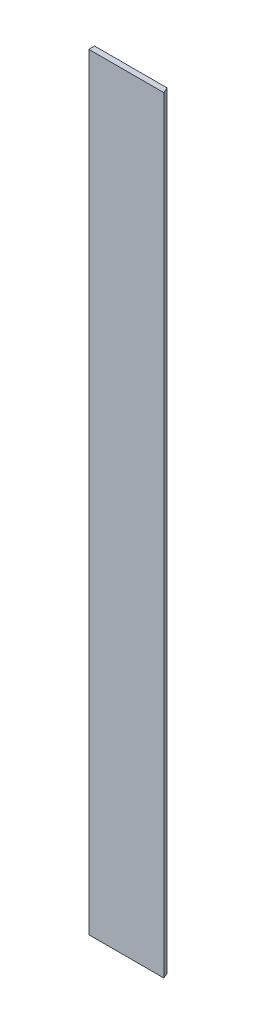
ISO-10303-21;
HEADER;
FILE_DESCRIPTION(('STEP AP214'),'2;1');
FILE_NAME('part.step','',(''),(''),'','','');
FILE_SCHEMA(('AUTOMOTIVE_DESIGN { 1 0 10303 214 1 1 1 1 }'));
ENDSEC;
DATA;
#1=APPLICATION_CONTEXT('core data for automotive mechanical design processes');
#2=APPLICATION_PROTOCOL_DEFINITION('international standard','automotive_design',2000,#1);
#3=PRODUCT_CONTEXT('',#1,'mechanical');
#4=PRODUCT('Part','Part','',(#3));
#5=PRODUCT_RELATED_PRODUCT_CATEGORY('part','',(#4));
#6=PRODUCT_DEFINITION_FORMATION('','',#4);
#7=PRODUCT_DEFINITION_CONTEXT('part definition',#1,'design');
#8=PRODUCT_DEFINITION('design','',#6,#7);
#9=PRODUCT_DEFINITION_SHAPE('','',#8);
#10=(LENGTH_UNIT() NAMED_UNIT(*) SI_UNIT(.MILLI.,.METRE.));
#11=(NAMED_UNIT(*) PLANE_ANGLE_UNIT() SI_UNIT($,.RADIAN.));
#12=(NAMED_UNIT(*) SI_UNIT($,.STERADIAN.) SOLID_ANGLE_UNIT());
#13=UNCERTAINTY_MEASURE_WITH_UNIT(LENGTH_MEASURE(1.E-05),#10,'distance_accuracy_value','');
#14=(GEOMETRIC_REPRESENTATION_CONTEXT(3) GLOBAL_UNCERTAINTY_ASSIGNED_CONTEXT((#13)) GLOBAL_UNIT_ASSIGNED_CONTEXT((#10,
#11,#12)) REPRESENTATION_CONTEXT('',''));
#15=CARTESIAN_POINT('',(0.,0.,0.));
#16=DIRECTION('',(0.,0.,1.));
#17=DIRECTION('',(1.,0.,0.));
#18=AXIS2_PLACEMENT_3D('',#15,#16,#17);
#19=CARTESIAN_POINT('',(0.,585.469885525601,1.));
#20=DIRECTION('',(1.,0.,0.));
#21=DIRECTION('',(0.,0.,-1.));
#22=AXIS2_PLACEMENT_3D('',#19,#20,#21);
#23=PLANE('',#22);
#24=DIRECTION('',(0.,0.,1.));
#25=VECTOR('',#24,1.);
#26=CARTESIAN_POINT('',(0.,533.213673316679,0.999999999999992));
#27=LINE('',#26,#25);
#28=CARTESIAN_POINT('',(0.,533.213673316679,1.));
#29=VERTEX_POINT('',#28);
#30=CARTESIAN_POINT('',(0.,533.213673316679,5.));
#31=VERTEX_POINT('',#30);
#32=EDGE_CURVE('E81',#29,#31,#27,.T.);
#33=ORIENTED_EDGE('',*,*,#32,.F.);
#34=DIRECTION('',(0.,-1.,0.));
#35=VECTOR('',#34,1.);
#36=CARTESIAN_POINT('',(0.,585.469885525601,1.));
#37=LINE('',#36,#35);
#38=CARTESIAN_POINT('',(0.,0.,1.));
#39=VERTEX_POINT('',#38);
#40=EDGE_CURVE('E35',#29,#39,#37,.T.);
#41=ORIENTED_EDGE('',*,*,#40,.T.);
#42=DIRECTION('',(0.,0.,1.));
#43=VECTOR('',#42,1.);
#44=CARTESIAN_POINT('',(0.,0.,1.));
#45=LINE('',#44,#43);
#46=CARTESIAN_POINT('',(0.,0.,5.));
#47=VERTEX_POINT('',#46);
#48=EDGE_CURVE('E79',#39,#47,#45,.T.);
#49=ORIENTED_EDGE('',*,*,#48,.T.);
#50=DIRECTION('',(0.,-1.,0.));
#51=VECTOR('',#50,1.);
#52=CARTESIAN_POINT('',(0.,585.469885525601,5.));
#53=LINE('',#52,#51);
#54=EDGE_CURVE('E70',#31,#47,#53,.T.);
#55=ORIENTED_EDGE('',*,*,#54,.F.);
#56=EDGE_LOOP('',(#33,#41,#49,#55));
#57=FACE_BOUND('',#56,.T.);
#58=ADVANCED_FACE('F31',(#57),#23,.F.);
#59=CARTESIAN_POINT('',(0.,585.469885525601,5.));
#60=DIRECTION('',(0.,0.,-1.));
#61=DIRECTION('',(-1.,0.,0.));
#62=AXIS2_PLACEMENT_3D('',#59,#60,#61);
#63=PLANE('',#62);
#64=DIRECTION('',(1.,0.,0.));
#65=VECTOR('',#64,1.);
#66=CARTESIAN_POINT('',(0.,533.213673316679,5.));
#67=LINE('',#66,#65);
#68=CARTESIAN_POINT('',(52.1028954514419,533.213673316679,5.));
#69=VERTEX_POINT('',#68);
#70=EDGE_CURVE('E40',#31,#69,#67,.T.);
#71=ORIENTED_EDGE('',*,*,#70,.F.);
#72=ORIENTED_EDGE('',*,*,#54,.T.);
#73=DIRECTION('',(1.,0.,0.));
#74=VECTOR('',#73,1.);
#75=CARTESIAN_POINT('',(0.,0.,5.));
#76=LINE('',#75,#74);
#77=CARTESIAN_POINT('',(52.1028954514419,0.,5.));
#78=VERTEX_POINT('',#77);
#79=EDGE_CURVE('E91',#47,#78,#76,.T.);
#80=ORIENTED_EDGE('',*,*,#79,.T.);
#81=DIRECTION('',(0.,-1.,0.));
#82=VECTOR('',#81,1.);
#83=CARTESIAN_POINT('',(52.1028954514419,585.469885525601,5.));
#84=LINE('',#83,#82);
#85=EDGE_CURVE('E100',#69,#78,#84,.T.);
#86=ORIENTED_EDGE('',*,*,#85,.F.);
#87=EDGE_LOOP('',(#71,#72,#80,#86));
#88=FACE_BOUND('',#87,.T.);
#89=ADVANCED_FACE('F104',(#88),#63,.F.);
#90=CARTESIAN_POINT('',(50.4852053081872,585.469885525601,1.));
#91=DIRECTION('',(-0.927056191465732,0.,0.374922415794324));
#92=DIRECTION('',(0.374922415794324,0.,0.927056191465732));
#93=AXIS2_PLACEMENT_3D('',#90,#91,#92);
#94=PLANE('',#93);
#95=DIRECTION('',(-0.374922415794324,0.,-0.927056191465732));
#96=VECTOR('',#95,1.);
#97=CARTESIAN_POINT('',(50.4852053081872,533.213673316679,0.999999999999994));
#98=LINE('',#97,#96);
#99=CARTESIAN_POINT('',(50.4852053081872,533.213673316679,1.));
#100=VERTEX_POINT('',#99);
#101=EDGE_CURVE('E11',#69,#100,#98,.T.);
#102=ORIENTED_EDGE('',*,*,#101,.F.);
#103=ORIENTED_EDGE('',*,*,#85,.T.);
#104=DIRECTION('',(-0.374922415794324,0.,-0.927056191465732));
#105=VECTOR('',#104,1.);
#106=CARTESIAN_POINT('',(50.4852053081872,0.,1.));
#107=LINE('',#106,#105);
#108=CARTESIAN_POINT('',(50.4852053081872,0.,1.));
#109=VERTEX_POINT('',#108);
#110=EDGE_CURVE('E101',#78,#109,#107,.T.);
#111=ORIENTED_EDGE('',*,*,#110,.T.);
#112=DIRECTION('',(0.,-1.,0.));
#113=VECTOR('',#112,1.);
#114=CARTESIAN_POINT('',(50.4852053081872,585.469885525601,1.));
#115=LINE('',#114,#113);
#116=EDGE_CURVE('E53',#100,#109,#115,.T.);
#117=ORIENTED_EDGE('',*,*,#116,.F.);
#118=EDGE_LOOP('',(#102,#103,#111,#117));
#119=FACE_BOUND('',#118,.T.);
#120=ADVANCED_FACE('F103',(#119),#94,.F.);
#121=CARTESIAN_POINT('',(0.,585.469885525601,1.));
#122=DIRECTION('',(0.,0.,1.));
#123=DIRECTION('',(1.,0.,0.));
#124=AXIS2_PLACEMENT_3D('',#121,#122,#123);
#125=PLANE('',#124);
#126=DIRECTION('',(-1.,0.,0.));
#127=VECTOR('',#126,1.);
#128=CARTESIAN_POINT('',(0.,533.213673316679,1.));
#129=LINE('',#128,#127);
#130=EDGE_CURVE('E88',#100,#29,#129,.T.);
#131=ORIENTED_EDGE('',*,*,#130,.F.);
#132=ORIENTED_EDGE('',*,*,#116,.T.);
#133=DIRECTION('',(-1.,0.,0.));
#134=VECTOR('',#133,1.);
#135=CARTESIAN_POINT('',(0.,0.,1.));
#136=LINE('',#135,#134);
#137=EDGE_CURVE('E84',#109,#39,#136,.T.);
#138=ORIENTED_EDGE('',*,*,#137,.T.);
#139=ORIENTED_EDGE('',*,*,#40,.F.);
#140=EDGE_LOOP('',(#131,#132,#138,#139));
#141=FACE_BOUND('',#140,.T.);
#142=ADVANCED_FACE('F85',(#141),#125,.F.);
#143=CARTESIAN_POINT('',(0.,0.,5.));
#144=DIRECTION('',(0.,1.,0.));
#145=DIRECTION('',(0.,0.,1.));
#146=AXIS2_PLACEMENT_3D('',#143,#144,#145);
#147=PLANE('',#146);
#148=ORIENTED_EDGE('',*,*,#48,.F.);
#149=ORIENTED_EDGE('',*,*,#137,.F.);
#150=ORIENTED_EDGE('',*,*,#110,.F.);
#151=ORIENTED_EDGE('',*,*,#79,.F.);
#152=EDGE_LOOP('',(#148,#149,#150,#151));
#153=FACE_BOUND('',#152,.T.);
#154=ADVANCED_FACE('F90',(#153),#147,.F.);
#155=CARTESIAN_POINT('',(8.51267245440291,533.213673316679,-172.278807200698));
#156=DIRECTION('',(0.,1.,0.));
#157=DIRECTION('',(0.,0.,-1.));
#158=AXIS2_PLACEMENT_3D('',#155,#156,#157);
#159=PLANE('',#158);
#160=ORIENTED_EDGE('',*,*,#130,.T.);
#161=ORIENTED_EDGE('',*,*,#32,.T.);
#162=ORIENTED_EDGE('',*,*,#70,.T.);
#163=ORIENTED_EDGE('',*,*,#101,.T.);
#164=EDGE_LOOP('',(#160,#161,#162,#163));
#165=FACE_BOUND('',#164,.T.);
#166=ADVANCED_FACE('F33',(#165),#159,.T.);
#167=CLOSED_SHELL('',(#58,#89,#120,#142,#154,#166));
#168=MANIFOLD_SOLID_BREP('B2',#167);
#169=ADVANCED_BREP_SHAPE_REPRESENTATION('',(#18,#168),#14);
#170=SHAPE_DEFINITION_REPRESENTATION(#9,#169);
ENDSEC;
END-ISO-10303-21;
